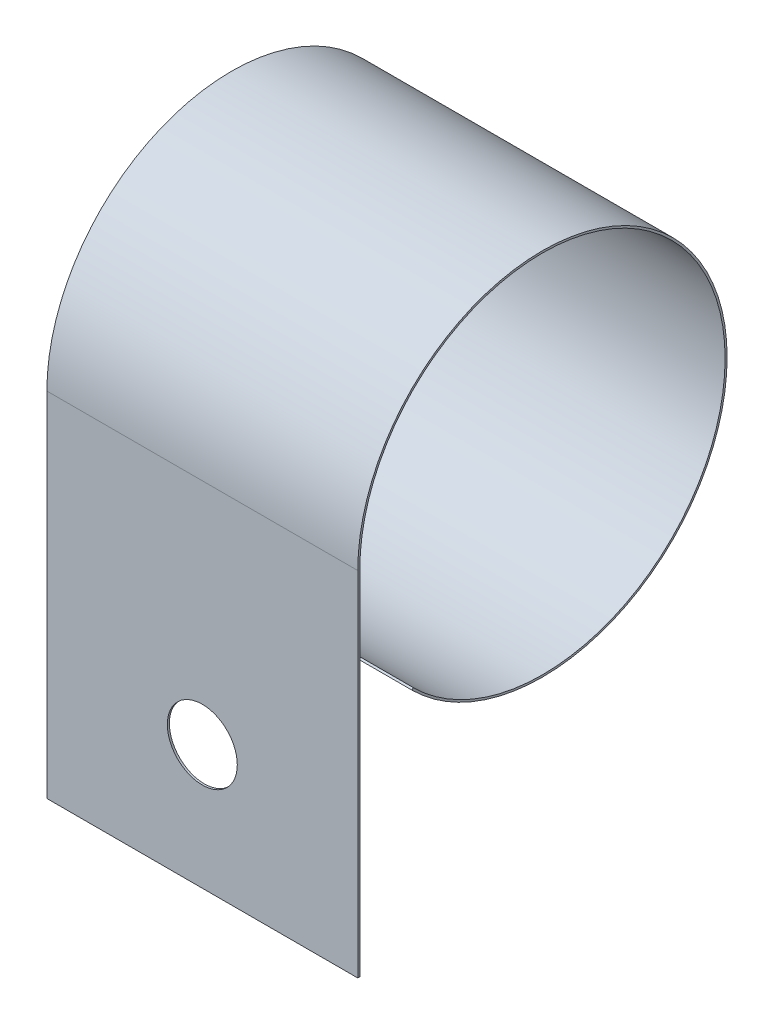
ISO-10303-21;
HEADER;
FILE_DESCRIPTION(('STEP AP214'),'2;1');
FILE_NAME('part.step','',(''),(''),'','','');
FILE_SCHEMA(('AUTOMOTIVE_DESIGN { 1 0 10303 214 1 1 1 1 }'));
ENDSEC;
DATA;
#1=APPLICATION_CONTEXT('core data for automotive mechanical design processes');
#2=APPLICATION_PROTOCOL_DEFINITION('international standard','automotive_design',2000,#1);
#3=PRODUCT_CONTEXT('',#1,'mechanical');
#4=PRODUCT('Part','Part','',(#3));
#5=PRODUCT_RELATED_PRODUCT_CATEGORY('part','',(#4));
#6=PRODUCT_DEFINITION_FORMATION('','',#4);
#7=PRODUCT_DEFINITION_CONTEXT('part definition',#1,'design');
#8=PRODUCT_DEFINITION('design','',#6,#7);
#9=PRODUCT_DEFINITION_SHAPE('','',#8);
#10=(LENGTH_UNIT() NAMED_UNIT(*) SI_UNIT(.MILLI.,.METRE.));
#11=(NAMED_UNIT(*) PLANE_ANGLE_UNIT() SI_UNIT($,.RADIAN.));
#12=(NAMED_UNIT(*) SI_UNIT($,.STERADIAN.) SOLID_ANGLE_UNIT());
#13=UNCERTAINTY_MEASURE_WITH_UNIT(LENGTH_MEASURE(1.E-05),#10,'distance_accuracy_value','');
#14=(GEOMETRIC_REPRESENTATION_CONTEXT(3) GLOBAL_UNCERTAINTY_ASSIGNED_CONTEXT((#13)) GLOBAL_UNIT_ASSIGNED_CONTEXT((#10,
#11,#12)) REPRESENTATION_CONTEXT('',''));
#15=CARTESIAN_POINT('',(0.,0.,0.));
#16=DIRECTION('',(0.,0.,1.));
#17=DIRECTION('',(1.,0.,0.));
#18=AXIS2_PLACEMENT_3D('',#15,#16,#17);
#19=CARTESIAN_POINT('',(10.,-22.7,11.88));
#20=DIRECTION('',(0.,0.,-1.));
#21=DIRECTION('',(0.,1.,0.));
#22=AXIS2_PLACEMENT_3D('',#19,#20,#21);
#23=PLANE('',#22);
#24=DIRECTION('',(0.,-1.,0.));
#25=VECTOR('',#24,1.);
#26=CARTESIAN_POINT('',(-10.,-22.7,11.88));
#27=LINE('',#26,#25);
#28=CARTESIAN_POINT('',(-10.,0.,11.88));
#29=VERTEX_POINT('',#28);
#30=CARTESIAN_POINT('',(-10.,-22.7,11.88));
#31=VERTEX_POINT('',#30);
#32=EDGE_CURVE('E115',#29,#31,#27,.T.);
#33=ORIENTED_EDGE('',*,*,#32,.T.);
#34=DIRECTION('',(-1.,0.,0.));
#35=VECTOR('',#34,1.);
#36=CARTESIAN_POINT('',(10.,-22.7,11.88));
#37=LINE('',#36,#35);
#38=CARTESIAN_POINT('',(10.,-22.7,11.88));
#39=VERTEX_POINT('',#38);
#40=EDGE_CURVE('E112',#39,#31,#37,.T.);
#41=ORIENTED_EDGE('',*,*,#40,.F.);
#42=DIRECTION('',(0.,-1.,0.));
#43=VECTOR('',#42,1.);
#44=CARTESIAN_POINT('',(10.,-22.7,11.88));
#45=LINE('',#44,#43);
#46=CARTESIAN_POINT('',(10.,0.,11.88));
#47=VERTEX_POINT('',#46);
#48=EDGE_CURVE('E101',#47,#39,#45,.T.);
#49=ORIENTED_EDGE('',*,*,#48,.F.);
#50=DIRECTION('',(-1.,0.,0.));
#51=VECTOR('',#50,1.);
#52=CARTESIAN_POINT('',(10.,0.,11.88));
#53=LINE('',#52,#51);
#54=EDGE_CURVE('E116',#47,#29,#53,.T.);
#55=ORIENTED_EDGE('',*,*,#54,.T.);
#56=EDGE_LOOP('',(#33,#41,#49,#55));
#57=FACE_BOUND('',#56,.T.);
#58=CARTESIAN_POINT('',(0.,-14.7,11.88));
#59=DIRECTION('',(0.,0.,-1.));
#60=DIRECTION('',(-1.,0.,0.));
#61=AXIS2_PLACEMENT_3D('',#58,#59,#60);
#62=CIRCLE('',#61,2.25);
#63=CARTESIAN_POINT('',(2.25,-14.7,11.88));
#64=VERTEX_POINT('',#63);
#65=EDGE_CURVE('E129',#64,#64,#62,.T.);
#66=ORIENTED_EDGE('',*,*,#65,.T.);
#67=EDGE_LOOP('',(#66));
#68=FACE_BOUND('',#67,.T.);
#69=ADVANCED_FACE('F40',(#57,#68),#23,.F.);
#70=CARTESIAN_POINT('',(10.,-22.7,11.75));
#71=DIRECTION('',(0.,0.,1.));
#72=DIRECTION('',(0.,-1.,0.));
#73=AXIS2_PLACEMENT_3D('',#70,#71,#72);
#74=PLANE('',#73);
#75=DIRECTION('',(0.,1.,0.));
#76=VECTOR('',#75,1.);
#77=CARTESIAN_POINT('',(-10.,-22.7,11.75));
#78=LINE('',#77,#76);
#79=CARTESIAN_POINT('',(-10.,-22.7,11.75));
#80=VERTEX_POINT('',#79);
#81=CARTESIAN_POINT('',(-10.,0.,11.75));
#82=VERTEX_POINT('',#81);
#83=EDGE_CURVE('E86',#80,#82,#78,.T.);
#84=ORIENTED_EDGE('',*,*,#83,.T.);
#85=DIRECTION('',(-1.,0.,0.));
#86=VECTOR('',#85,1.);
#87=CARTESIAN_POINT('',(10.,0.,11.75));
#88=LINE('',#87,#86);
#89=CARTESIAN_POINT('',(10.,0.,11.75));
#90=VERTEX_POINT('',#89);
#91=EDGE_CURVE('E121',#90,#82,#88,.T.);
#92=ORIENTED_EDGE('',*,*,#91,.F.);
#93=DIRECTION('',(0.,1.,0.));
#94=VECTOR('',#93,1.);
#95=CARTESIAN_POINT('',(10.,-22.7,11.75));
#96=LINE('',#95,#94);
#97=CARTESIAN_POINT('',(10.,-22.7,11.75));
#98=VERTEX_POINT('',#97);
#99=EDGE_CURVE('E57',#98,#90,#96,.T.);
#100=ORIENTED_EDGE('',*,*,#99,.F.);
#101=DIRECTION('',(-1.,0.,0.));
#102=VECTOR('',#101,1.);
#103=CARTESIAN_POINT('',(10.,-22.7,11.75));
#104=LINE('',#103,#102);
#105=EDGE_CURVE('E117',#98,#80,#104,.T.);
#106=ORIENTED_EDGE('',*,*,#105,.T.);
#107=EDGE_LOOP('',(#84,#92,#100,#106));
#108=FACE_BOUND('',#107,.T.);
#109=CARTESIAN_POINT('',(0.,-14.7,11.75));
#110=DIRECTION('',(0.,0.,1.));
#111=DIRECTION('',(0.,-1.,0.));
#112=AXIS2_PLACEMENT_3D('',#109,#110,#111);
#113=CIRCLE('',#112,2.25);
#114=CARTESIAN_POINT('',(2.25,-14.7,11.75));
#115=VERTEX_POINT('',#114);
#116=EDGE_CURVE('E155',#115,#115,#113,.T.);
#117=ORIENTED_EDGE('',*,*,#116,.T.);
#118=EDGE_LOOP('',(#117));
#119=FACE_BOUND('',#118,.T.);
#120=ADVANCED_FACE('F149',(#108,#119),#74,.F.);
#121=CARTESIAN_POINT('',(10.,0.,0.));
#122=DIRECTION('',(-1.,0.,0.));
#123=DIRECTION('',(0.,0.,1.));
#124=AXIS2_PLACEMENT_3D('',#121,#122,#123);
#125=CYLINDRICAL_SURFACE('',#124,11.75);
#126=CARTESIAN_POINT('',(-10.,0.,0.));
#127=DIRECTION('',(-1.,0.,0.));
#128=DIRECTION('',(0.,0.,1.));
#129=AXIS2_PLACEMENT_3D('',#126,#127,#128);
#130=CIRCLE('',#129,11.75);
#131=CARTESIAN_POINT('',(-10.,-8.3085046789419,8.30850467894197));
#132=VERTEX_POINT('',#131);
#133=EDGE_CURVE('E125',#82,#132,#130,.T.);
#134=ORIENTED_EDGE('',*,*,#133,.T.);
#135=DIRECTION('',(-1.,0.,0.));
#136=VECTOR('',#135,1.);
#137=CARTESIAN_POINT('',(10.,-8.3085046789419,8.30850467894197));
#138=LINE('',#137,#136);
#139=CARTESIAN_POINT('',(10.,-8.3085046789419,8.30850467894197));
#140=VERTEX_POINT('',#139);
#141=EDGE_CURVE('E11',#140,#132,#138,.T.);
#142=ORIENTED_EDGE('',*,*,#141,.F.);
#143=CARTESIAN_POINT('',(10.,0.,0.));
#144=DIRECTION('',(-1.,0.,0.));
#145=DIRECTION('',(0.,0.,1.));
#146=AXIS2_PLACEMENT_3D('',#143,#144,#145);
#147=CIRCLE('',#146,11.75);
#148=EDGE_CURVE('E136',#90,#140,#147,.T.);
#149=ORIENTED_EDGE('',*,*,#148,.F.);
#150=ORIENTED_EDGE('',*,*,#91,.T.);
#151=EDGE_LOOP('',(#134,#142,#149,#150));
#152=FACE_BOUND('',#151,.T.);
#153=ADVANCED_FACE('F42',(#152),#125,.F.);
#154=CARTESIAN_POINT('',(10.,-8.40042856049615,8.40042856049622));
#155=DIRECTION('',(0.,-0.707106781186548,-0.707106781186548));
#156=DIRECTION('',(0.,0.707106781186548,-0.707106781186548));
#157=AXIS2_PLACEMENT_3D('',#154,#155,#156);
#158=PLANE('',#157);
#159=DIRECTION('',(0.,-0.707106781186547,0.707106781186547));
#160=VECTOR('',#159,1.);
#161=CARTESIAN_POINT('',(-10.,-8.40042856049615,8.40042856049622));
#162=LINE('',#161,#160);
#163=CARTESIAN_POINT('',(-10.,-8.40042856049615,8.40042856049622));
#164=VERTEX_POINT('',#163);
#165=EDGE_CURVE('E128',#132,#164,#162,.T.);
#166=ORIENTED_EDGE('',*,*,#165,.T.);
#167=DIRECTION('',(-1.,0.,0.));
#168=VECTOR('',#167,1.);
#169=CARTESIAN_POINT('',(10.,-8.40042856049615,8.40042856049622));
#170=LINE('',#169,#168);
#171=CARTESIAN_POINT('',(10.,-8.40042856049615,8.40042856049622));
#172=VERTEX_POINT('',#171);
#173=EDGE_CURVE('E49',#172,#164,#170,.T.);
#174=ORIENTED_EDGE('',*,*,#173,.F.);
#175=DIRECTION('',(0.,-0.707106781186547,0.707106781186547));
#176=VECTOR('',#175,1.);
#177=CARTESIAN_POINT('',(10.,-8.40042856049615,8.40042856049622));
#178=LINE('',#177,#176);
#179=EDGE_CURVE('E94',#140,#172,#178,.T.);
#180=ORIENTED_EDGE('',*,*,#179,.F.);
#181=ORIENTED_EDGE('',*,*,#141,.T.);
#182=EDGE_LOOP('',(#166,#174,#180,#181));
#183=FACE_BOUND('',#182,.T.);
#184=ADVANCED_FACE('F179',(#183),#158,.F.);
#185=CARTESIAN_POINT('',(10.,0.,0.));
#186=DIRECTION('',(-1.,0.,0.));
#187=DIRECTION('',(0.,0.,1.));
#188=AXIS2_PLACEMENT_3D('',#185,#186,#187);
#189=CYLINDRICAL_SURFACE('',#188,11.88);
#190=CARTESIAN_POINT('',(-10.,0.,0.));
#191=DIRECTION('',(1.,0.,0.));
#192=DIRECTION('',(0.,0.,1.));
#193=AXIS2_PLACEMENT_3D('',#190,#191,#192);
#194=CIRCLE('',#193,11.88);
#195=EDGE_CURVE('E131',#164,#29,#194,.T.);
#196=ORIENTED_EDGE('',*,*,#195,.T.);
#197=ORIENTED_EDGE('',*,*,#54,.F.);
#198=CARTESIAN_POINT('',(10.,0.,0.));
#199=DIRECTION('',(1.,0.,0.));
#200=DIRECTION('',(0.,0.,1.));
#201=AXIS2_PLACEMENT_3D('',#198,#199,#200);
#202=CIRCLE('',#201,11.88);
#203=EDGE_CURVE('E107',#172,#47,#202,.T.);
#204=ORIENTED_EDGE('',*,*,#203,.F.);
#205=ORIENTED_EDGE('',*,*,#173,.T.);
#206=EDGE_LOOP('',(#196,#197,#204,#205));
#207=FACE_BOUND('',#206,.T.);
#208=ADVANCED_FACE('F142',(#207),#189,.T.);
#209=CARTESIAN_POINT('',(10.,-22.7,11.75));
#210=DIRECTION('',(0.,1.,0.));
#211=DIRECTION('',(0.,0.,1.));
#212=AXIS2_PLACEMENT_3D('',#209,#210,#211);
#213=PLANE('',#212);
#214=DIRECTION('',(0.,0.,-1.));
#215=VECTOR('',#214,1.);
#216=CARTESIAN_POINT('',(-10.,-22.7,11.75));
#217=LINE('',#216,#215);
#218=EDGE_CURVE('E80',#31,#80,#217,.T.);
#219=ORIENTED_EDGE('',*,*,#218,.T.);
#220=ORIENTED_EDGE('',*,*,#105,.F.);
#221=DIRECTION('',(0.,0.,-1.));
#222=VECTOR('',#221,1.);
#223=CARTESIAN_POINT('',(10.,-22.7,11.75));
#224=LINE('',#223,#222);
#225=EDGE_CURVE('E105',#39,#98,#224,.T.);
#226=ORIENTED_EDGE('',*,*,#225,.F.);
#227=ORIENTED_EDGE('',*,*,#40,.T.);
#228=EDGE_LOOP('',(#219,#220,#226,#227));
#229=FACE_BOUND('',#228,.T.);
#230=ADVANCED_FACE('F119',(#229),#213,.F.);
#231=CARTESIAN_POINT('',(10.,0.,0.));
#232=DIRECTION('',(-1.,0.,0.));
#233=DIRECTION('',(0.,0.,1.));
#234=AXIS2_PLACEMENT_3D('',#231,#232,#233);
#235=PLANE('',#234);
#236=ORIENTED_EDGE('',*,*,#148,.T.);
#237=ORIENTED_EDGE('',*,*,#179,.T.);
#238=ORIENTED_EDGE('',*,*,#203,.T.);
#239=ORIENTED_EDGE('',*,*,#48,.T.);
#240=ORIENTED_EDGE('',*,*,#225,.T.);
#241=ORIENTED_EDGE('',*,*,#99,.T.);
#242=EDGE_LOOP('',(#236,#237,#238,#239,#240,#241));
#243=FACE_BOUND('',#242,.T.);
#244=ADVANCED_FACE('F103',(#243),#235,.F.);
#245=CARTESIAN_POINT('',(-10.,0.,0.));
#246=DIRECTION('',(-1.,0.,0.));
#247=DIRECTION('',(0.,0.,1.));
#248=AXIS2_PLACEMENT_3D('',#245,#246,#247);
#249=PLANE('',#248);
#250=ORIENTED_EDGE('',*,*,#133,.F.);
#251=ORIENTED_EDGE('',*,*,#83,.F.);
#252=ORIENTED_EDGE('',*,*,#218,.F.);
#253=ORIENTED_EDGE('',*,*,#32,.F.);
#254=ORIENTED_EDGE('',*,*,#195,.F.);
#255=ORIENTED_EDGE('',*,*,#165,.F.);
#256=EDGE_LOOP('',(#250,#251,#252,#253,#254,#255));
#257=FACE_BOUND('',#256,.T.);
#258=ADVANCED_FACE('F145',(#257),#249,.T.);
#259=CARTESIAN_POINT('',(0.,-14.7,-11.881));
#260=DIRECTION('',(0.,0.,1.));
#261=DIRECTION('',(1.,0.,0.));
#262=AXIS2_PLACEMENT_3D('',#259,#260,#261);
#263=CYLINDRICAL_SURFACE('',#262,2.25);
#264=CARTESIAN_POINT('',(2.25,-14.7,11.88));
#265=CARTESIAN_POINT('',(2.25,-14.7,11.8786458333333));
#266=CARTESIAN_POINT('',(2.25,-14.7,11.8772916666667));
#267=CARTESIAN_POINT('',(2.25,-14.7,11.8745833333333));
#268=CARTESIAN_POINT('',(2.25,-14.7,11.8732291666667));
#269=CARTESIAN_POINT('',(2.25,-14.7,11.8705208333333));
#270=CARTESIAN_POINT('',(2.25,-14.7,11.8691666666667));
#271=CARTESIAN_POINT('',(2.25,-14.7,11.8664583333333));
#272=CARTESIAN_POINT('',(2.25,-14.7,11.8651041666667));
#273=CARTESIAN_POINT('',(2.25,-14.7,11.8623958333333));
#274=CARTESIAN_POINT('',(2.25,-14.7,11.8610416666667));
#275=CARTESIAN_POINT('',(2.25,-14.7,11.8583333333333));
#276=CARTESIAN_POINT('',(2.25,-14.7,11.8569791666667));
#277=CARTESIAN_POINT('',(2.25,-14.7,11.8542708333333));
#278=CARTESIAN_POINT('',(2.25,-14.7,11.8529166666667));
#279=CARTESIAN_POINT('',(2.25,-14.7,11.8502083333333));
#280=CARTESIAN_POINT('',(2.25,-14.7,11.8488541666667));
#281=CARTESIAN_POINT('',(2.25,-14.7,11.8461458333333));
#282=CARTESIAN_POINT('',(2.25,-14.7,11.8447916666667));
#283=CARTESIAN_POINT('',(2.25,-14.7,11.8420833333333));
#284=CARTESIAN_POINT('',(2.25,-14.7,11.8407291666667));
#285=CARTESIAN_POINT('',(2.25,-14.7,11.8380208333333));
#286=CARTESIAN_POINT('',(2.25,-14.7,11.8366666666667));
#287=CARTESIAN_POINT('',(2.25,-14.7,11.8339583333333));
#288=CARTESIAN_POINT('',(2.25,-14.7,11.8326041666667));
#289=CARTESIAN_POINT('',(2.25,-14.7,11.8298958333333));
#290=CARTESIAN_POINT('',(2.25,-14.7,11.8285416666667));
#291=CARTESIAN_POINT('',(2.25,-14.7,11.8258333333333));
#292=CARTESIAN_POINT('',(2.25,-14.7,11.8244791666667));
#293=CARTESIAN_POINT('',(2.25,-14.7,11.8217708333333));
#294=CARTESIAN_POINT('',(2.25,-14.7,11.8204166666667));
#295=CARTESIAN_POINT('',(2.25,-14.7,11.8177083333333));
#296=CARTESIAN_POINT('',(2.25,-14.7,11.8163541666667));
#297=CARTESIAN_POINT('',(2.25,-14.7,11.8136458333333));
#298=CARTESIAN_POINT('',(2.25,-14.7,11.8122916666667));
#299=CARTESIAN_POINT('',(2.25,-14.7,11.8095833333333));
#300=CARTESIAN_POINT('',(2.25,-14.7,11.8082291666667));
#301=CARTESIAN_POINT('',(2.25,-14.7,11.8055208333333));
#302=CARTESIAN_POINT('',(2.25,-14.7,11.8041666666667));
#303=CARTESIAN_POINT('',(2.25,-14.7,11.8014583333333));
#304=CARTESIAN_POINT('',(2.25,-14.7,11.8001041666667));
#305=CARTESIAN_POINT('',(2.25,-14.7,11.7973958333333));
#306=CARTESIAN_POINT('',(2.25,-14.7,11.7960416666667));
#307=CARTESIAN_POINT('',(2.25,-14.7,11.7933333333333));
#308=CARTESIAN_POINT('',(2.25,-14.7,11.7919791666667));
#309=CARTESIAN_POINT('',(2.25,-14.7,11.7892708333333));
#310=CARTESIAN_POINT('',(2.25,-14.7,11.7879166666667));
#311=CARTESIAN_POINT('',(2.25,-14.7,11.7852083333333));
#312=CARTESIAN_POINT('',(2.25,-14.7,11.7838541666667));
#313=CARTESIAN_POINT('',(2.25,-14.7,11.7811458333333));
#314=CARTESIAN_POINT('',(2.25,-14.7,11.7797916666667));
#315=CARTESIAN_POINT('',(2.25,-14.7,11.7770833333333));
#316=CARTESIAN_POINT('',(2.25,-14.7,11.7757291666667));
#317=CARTESIAN_POINT('',(2.25,-14.7,11.7730208333333));
#318=CARTESIAN_POINT('',(2.25,-14.7,11.7716666666667));
#319=CARTESIAN_POINT('',(2.25,-14.7,11.7689583333333));
#320=CARTESIAN_POINT('',(2.25,-14.7,11.7676041666667));
#321=CARTESIAN_POINT('',(2.25,-14.7,11.7648958333333));
#322=CARTESIAN_POINT('',(2.25,-14.7,11.7635416666667));
#323=CARTESIAN_POINT('',(2.25,-14.7,11.7608333333333));
#324=CARTESIAN_POINT('',(2.25,-14.7,11.7594791666667));
#325=CARTESIAN_POINT('',(2.25,-14.7,11.7567708333333));
#326=CARTESIAN_POINT('',(2.25,-14.7,11.7554166666667));
#327=CARTESIAN_POINT('',(2.25,-14.7,11.7527083333333));
#328=CARTESIAN_POINT('',(2.25,-14.7,11.7513541666667));
#329=CARTESIAN_POINT('',(2.25,-14.7,11.75));
#330=B_SPLINE_CURVE_WITH_KNOTS('',3,(#264,#265,#266,#267,#268,#269,#270,#271,#272,#273,#274,
#275,#276,#277,#278,#279,#280,#281,#282,#283,#284,#285,#286,#287,#288,#289,#290,#291,#292,#293,
#294,#295,#296,#297,#298,#299,#300,#301,#302,#303,#304,#305,#306,#307,#308,#309,#310,#311,#312,
#313,#314,#315,#316,#317,#318,#319,#320,#321,#322,#323,#324,#325,#326,#327,#328,#329),
.UNSPECIFIED.,.F.,.F.,(4,2,2,2,2,2,2,2,2,2,2,2,2,2,2,2,2,2,2,2,2,2,2,2,2,2,2,2,2,2,2,2,4),(0.,
0.00406249999999886,0.00812500000000119,0.0121875,0.0162500000000024,0.0203125000000012,
0.0243750000000036,0.0284375000000024,0.0325000000000047,0.0365625000000036,0.0406250000000025,
0.0446875000000048,0.0487500000000037,0.052812500000006,0.0568750000000048,0.0609375000000072,
0.065000000000006,0.0690625000000049,0.0731250000000072,0.0771875000000061,0.0812500000000084,
0.0853125000000073,0.0893750000000096,0.0934375000000084,0.0975000000000073,0.10156250000001,
0.105625000000008,0.109687500000011,0.11375000000001,0.117812500000012,0.121875000000011,
0.125937500000013,0.130000000000012),.UNSPECIFIED.);
#331=EDGE_CURVE('BSEAM164',#64,#115,#330,.T.);
#332=ORIENTED_EDGE('',*,*,#65,.F.);
#333=ORIENTED_EDGE('',*,*,#116,.F.);
#334=ORIENTED_EDGE('',*,*,#331,.T.);
#335=ORIENTED_EDGE('',*,*,#331,.F.);
#336=EDGE_LOOP('',(#332,#334,#333,#335));
#337=FACE_BOUND('',#336,.T.);
#338=ADVANCED_FACE('F164',(#337),#263,.F.);
#339=CLOSED_SHELL('',(#69,#120,#153,#184,#208,#230,#244,#258,#338));
#340=MANIFOLD_SOLID_BREP('B2',#339);
#341=ADVANCED_BREP_SHAPE_REPRESENTATION('',(#18,#340),#14);
#342=SHAPE_DEFINITION_REPRESENTATION(#9,#341);
ENDSEC;
END-ISO-10303-21;
